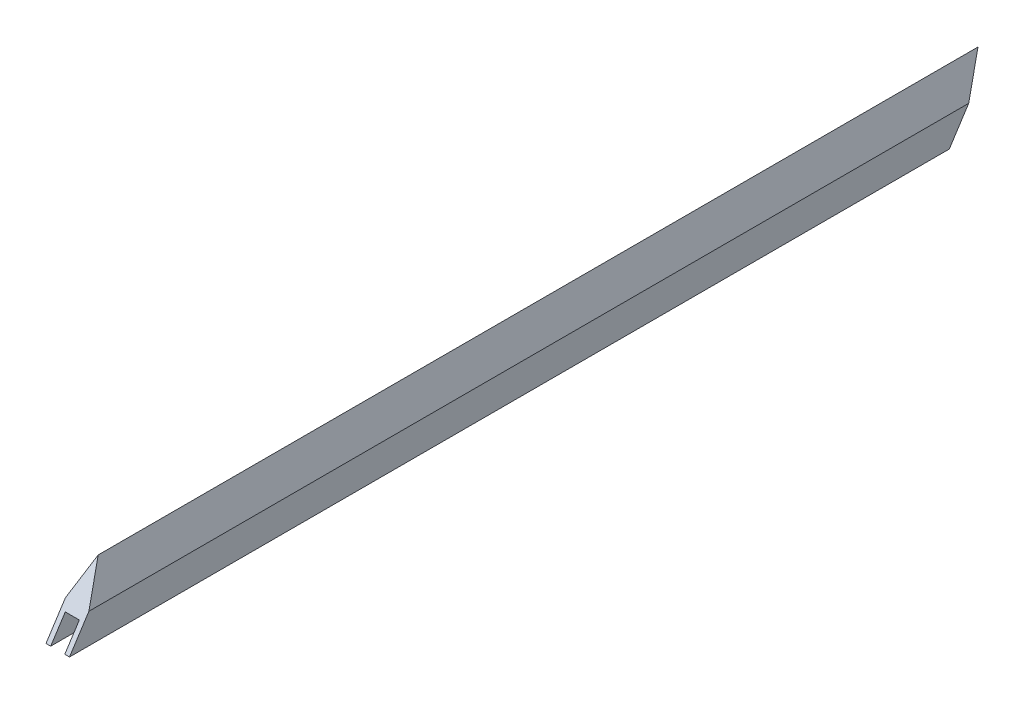
ISO-10303-21;
HEADER;
FILE_DESCRIPTION(('STEP AP214'),'2;1');
FILE_NAME('part.step','',(''),(''),'','','');
FILE_SCHEMA(('AUTOMOTIVE_DESIGN { 1 0 10303 214 1 1 1 1 }'));
ENDSEC;
DATA;
#1=APPLICATION_CONTEXT('core data for automotive mechanical design processes');
#2=APPLICATION_PROTOCOL_DEFINITION('international standard','automotive_design',2000,#1);
#3=PRODUCT_CONTEXT('',#1,'mechanical');
#4=PRODUCT('Part','Part','',(#3));
#5=PRODUCT_RELATED_PRODUCT_CATEGORY('part','',(#4));
#6=PRODUCT_DEFINITION_FORMATION('','',#4);
#7=PRODUCT_DEFINITION_CONTEXT('part definition',#1,'design');
#8=PRODUCT_DEFINITION('design','',#6,#7);
#9=PRODUCT_DEFINITION_SHAPE('','',#8);
#10=(LENGTH_UNIT() NAMED_UNIT(*) SI_UNIT(.MILLI.,.METRE.));
#11=(NAMED_UNIT(*) PLANE_ANGLE_UNIT() SI_UNIT($,.RADIAN.));
#12=(NAMED_UNIT(*) SI_UNIT($,.STERADIAN.) SOLID_ANGLE_UNIT());
#13=UNCERTAINTY_MEASURE_WITH_UNIT(LENGTH_MEASURE(1.E-05),#10,'distance_accuracy_value','');
#14=(GEOMETRIC_REPRESENTATION_CONTEXT(3) GLOBAL_UNCERTAINTY_ASSIGNED_CONTEXT((#13)) GLOBAL_UNIT_ASSIGNED_CONTEXT((#10,
#11,#12)) REPRESENTATION_CONTEXT('',''));
#15=CARTESIAN_POINT('',(0.,0.,0.));
#16=DIRECTION('',(0.,0.,1.));
#17=DIRECTION('',(1.,0.,0.));
#18=AXIS2_PLACEMENT_3D('',#15,#16,#17);
#19=CARTESIAN_POINT('',(0.,5.78299320744687,8.91524470213498));
#20=DIRECTION('',(0.,-0.544199833494635,-0.838955625301131));
#21=DIRECTION('',(0.,0.838955625301131,-0.544199833494635));
#22=AXIS2_PLACEMENT_3D('',#19,#20,#21);
#23=PLANE('',#22);
#24=DIRECTION('',(0.,0.838955625301131,-0.544199833494635));
#25=VECTOR('',#24,1.);
#26=CARTESIAN_POINT('',(2.38760000000002,-134.881067391288,100.158876722642));
#27=LINE('',#26,#25);
#28=CARTESIAN_POINT('',(2.3876,-3.81,15.13786857969));
#29=VERTEX_POINT('',#28);
#30=CARTESIAN_POINT('',(2.3876,3.81,10.1950532433713));
#31=VERTEX_POINT('',#30);
#32=EDGE_CURVE('E136',#29,#31,#27,.T.);
#33=ORIENTED_EDGE('',*,*,#32,.T.);
#34=DIRECTION('',(-1.,0.,0.));
#35=VECTOR('',#34,1.);
#36=CARTESIAN_POINT('',(-2.3876,3.81,10.1950532433713));
#37=LINE('',#36,#35);
#38=CARTESIAN_POINT('',(-2.3876,3.81,10.1950532433714));
#39=VERTEX_POINT('',#38);
#40=EDGE_CURVE('E129',#31,#39,#37,.T.);
#41=ORIENTED_EDGE('',*,*,#40,.T.);
#42=DIRECTION('',(0.,-0.838955625301131,0.544199833494635));
#43=VECTOR('',#42,1.);
#44=CARTESIAN_POINT('',(-2.38759999999998,-134.881067391288,100.158876722642));
#45=LINE('',#44,#43);
#46=CARTESIAN_POINT('',(-2.3876,-3.81,15.13786857969));
#47=VERTEX_POINT('',#46);
#48=EDGE_CURVE('E113',#39,#47,#45,.T.);
#49=ORIENTED_EDGE('',*,*,#48,.T.);
#50=DIRECTION('',(-1.,0.,0.));
#51=VECTOR('',#50,1.);
#52=CARTESIAN_POINT('',(-2.38759999999995,-3.81,15.1378685796899));
#53=LINE('',#52,#51);
#54=CARTESIAN_POINT('',(-3.9878,-3.81,15.13786857969));
#55=VERTEX_POINT('',#54);
#56=EDGE_CURVE('E127',#47,#55,#53,.T.);
#57=ORIENTED_EDGE('',*,*,#56,.T.);
#58=DIRECTION('',(0.,0.838955625301131,-0.544199833494635));
#59=VECTOR('',#58,1.);
#60=CARTESIAN_POINT('',(-3.98780000000001,-140.244378035418,103.637860201021));
#61=LINE('',#60,#59);
#62=CARTESIAN_POINT('',(-3.9878,6.34999999999998,8.54744813126525));
#63=VERTEX_POINT('',#62);
#64=EDGE_CURVE('E130',#55,#63,#61,.T.);
#65=ORIENTED_EDGE('',*,*,#64,.T.);
#66=DIRECTION('',(0.29071969836618,0.802719676698974,-0.520694898786394));
#67=VECTOR('',#66,1.);
#68=CARTESIAN_POINT('',(-50.221433991818,-121.307836531549,91.3544182374829));
#69=LINE('',#68,#67);
#70=CARTESIAN_POINT('',(0.,17.3609,1.40507997028495));
#71=VERTEX_POINT('',#70);
#72=EDGE_CURVE('E171',#63,#71,#69,.T.);
#73=ORIENTED_EDGE('',*,*,#72,.T.);
#74=DIRECTION('',(0.29071969836618,-0.802719676698973,0.520694898786394));
#75=VECTOR('',#74,1.);
#76=CARTESIAN_POINT('',(50.2214339918181,-121.307836531549,91.3544182374829));
#77=LINE('',#76,#75);
#78=CARTESIAN_POINT('',(3.9878,6.35,8.54744813126516));
#79=VERTEX_POINT('',#78);
#80=EDGE_CURVE('E168',#71,#79,#77,.T.);
#81=ORIENTED_EDGE('',*,*,#80,.T.);
#82=DIRECTION('',(0.,-0.838955625301131,0.544199833494635));
#83=VECTOR('',#82,1.);
#84=CARTESIAN_POINT('',(3.9878,-140.244378035418,103.637860201021));
#85=LINE('',#84,#83);
#86=CARTESIAN_POINT('',(3.9878,-3.81,15.13786857969));
#87=VERTEX_POINT('',#86);
#88=EDGE_CURVE('E143',#79,#87,#85,.T.);
#89=ORIENTED_EDGE('',*,*,#88,.T.);
#90=DIRECTION('',(-1.,0.,0.));
#91=VECTOR('',#90,1.);
#92=CARTESIAN_POINT('',(2.3876,-3.81,15.1378685796899));
#93=LINE('',#92,#91);
#94=EDGE_CURVE('E133',#87,#29,#93,.T.);
#95=ORIENTED_EDGE('',*,*,#94,.T.);
#96=EDGE_LOOP('',(#33,#41,#49,#57,#65,#73,#81,#89,#95));
#97=FACE_BOUND('',#96,.T.);
#98=ADVANCED_FACE('F36',(#97),#23,.T.);
#99=CARTESIAN_POINT('',(3.9878,-3.81,313.9694));
#100=DIRECTION('',(-1.,0.,0.));
#101=DIRECTION('',(0.,0.,1.));
#102=AXIS2_PLACEMENT_3D('',#99,#100,#101);
#103=PLANE('',#102);
#104=ORIENTED_EDGE('',*,*,#88,.F.);
#105=DIRECTION('',(0.,0.,-1.));
#106=VECTOR('',#105,1.);
#107=CARTESIAN_POINT('',(3.9878,6.35,313.9694));
#108=LINE('',#107,#106);
#109=CARTESIAN_POINT('',(3.9878,6.35,307.378979551575));
#110=VERTEX_POINT('',#109);
#111=EDGE_CURVE('E150',#110,#79,#108,.T.);
#112=ORIENTED_EDGE('',*,*,#111,.F.);
#113=DIRECTION('',(0.,0.838955625301131,-0.544199833494635));
#114=VECTOR('',#113,1.);
#115=CARTESIAN_POINT('',(3.9878,-3.81000000000002,313.9694));
#116=LINE('',#115,#114);
#117=CARTESIAN_POINT('',(3.9878,-3.81,313.9694));
#118=VERTEX_POINT('',#117);
#119=EDGE_CURVE('E155',#118,#110,#116,.T.);
#120=ORIENTED_EDGE('',*,*,#119,.F.);
#121=DIRECTION('',(0.,0.,-1.));
#122=VECTOR('',#121,1.);
#123=CARTESIAN_POINT('',(3.9878,-3.81,313.9694));
#124=LINE('',#123,#122);
#125=EDGE_CURVE('E40',#118,#87,#124,.T.);
#126=ORIENTED_EDGE('',*,*,#125,.T.);
#127=EDGE_LOOP('',(#104,#112,#120,#126));
#128=FACE_BOUND('',#127,.T.);
#129=ADVANCED_FACE('F200',(#128),#103,.F.);
#130=CARTESIAN_POINT('',(3.9878,6.35,313.9694));
#131=DIRECTION('',(-0.940235920067978,-0.34052373575703,0.));
#132=DIRECTION('',(0.34052373575703,-0.940235920067978,0.));
#133=AXIS2_PLACEMENT_3D('',#130,#131,#132);
#134=PLANE('',#133);
#135=ORIENTED_EDGE('',*,*,#80,.F.);
#136=DIRECTION('',(0.,0.,-1.));
#137=VECTOR('',#136,1.);
#138=CARTESIAN_POINT('',(0.,17.3609,313.9694));
#139=LINE('',#138,#137);
#140=CARTESIAN_POINT('',(0.,17.3609,300.236611390595));
#141=VERTEX_POINT('',#140);
#142=EDGE_CURVE('E149',#141,#71,#139,.T.);
#143=ORIENTED_EDGE('',*,*,#142,.F.);
#144=DIRECTION('',(-0.29071969836618,0.802719676698973,-0.520694898786394));
#145=VECTOR('',#144,1.);
#146=CARTESIAN_POINT('',(4.98543322511807,3.59538851535871,309.165795285418));
#147=LINE('',#146,#145);
#148=EDGE_CURVE('E159',#110,#141,#147,.T.);
#149=ORIENTED_EDGE('',*,*,#148,.F.);
#150=ORIENTED_EDGE('',*,*,#111,.T.);
#151=EDGE_LOOP('',(#135,#143,#149,#150));
#152=FACE_BOUND('',#151,.T.);
#153=ADVANCED_FACE('F198',(#152),#134,.F.);
#154=CARTESIAN_POINT('',(-3.9878,6.35,313.9694));
#155=DIRECTION('',(0.940235920067978,-0.34052373575703,0.));
#156=DIRECTION('',(0.34052373575703,0.940235920067978,0.));
#157=AXIS2_PLACEMENT_3D('',#154,#155,#156);
#158=PLANE('',#157);
#159=ORIENTED_EDGE('',*,*,#72,.F.);
#160=DIRECTION('',(0.,0.,-1.));
#161=VECTOR('',#160,1.);
#162=CARTESIAN_POINT('',(-3.9878,6.35,313.9694));
#163=LINE('',#162,#161);
#164=CARTESIAN_POINT('',(-3.9878,6.35,307.378979551575));
#165=VERTEX_POINT('',#164);
#166=EDGE_CURVE('E147',#165,#63,#163,.T.);
#167=ORIENTED_EDGE('',*,*,#166,.F.);
#168=DIRECTION('',(-0.29071969836618,-0.802719676698973,0.520694898786394));
#169=VECTOR('',#168,1.);
#170=CARTESIAN_POINT('',(-4.98543322511807,3.59538851535871,309.165795285418));
#171=LINE('',#170,#169);
#172=EDGE_CURVE('E163',#141,#165,#171,.T.);
#173=ORIENTED_EDGE('',*,*,#172,.F.);
#174=ORIENTED_EDGE('',*,*,#142,.T.);
#175=EDGE_LOOP('',(#159,#167,#173,#174));
#176=FACE_BOUND('',#175,.T.);
#177=ADVANCED_FACE('F197',(#176),#158,.F.);
#178=CARTESIAN_POINT('',(-3.9878,-3.81,313.9694));
#179=DIRECTION('',(1.,0.,0.));
#180=DIRECTION('',(0.,1.,0.));
#181=AXIS2_PLACEMENT_3D('',#178,#179,#180);
#182=PLANE('',#181);
#183=ORIENTED_EDGE('',*,*,#64,.F.);
#184=DIRECTION('',(0.,0.,-1.));
#185=VECTOR('',#184,1.);
#186=CARTESIAN_POINT('',(-3.9878,-3.81,313.9694));
#187=LINE('',#186,#185);
#188=CARTESIAN_POINT('',(-3.9878,-3.81,313.9694));
#189=VERTEX_POINT('',#188);
#190=EDGE_CURVE('E60',#189,#55,#187,.T.);
#191=ORIENTED_EDGE('',*,*,#190,.F.);
#192=DIRECTION('',(0.,-0.838955625301131,0.544199833494635));
#193=VECTOR('',#192,1.);
#194=CARTESIAN_POINT('',(-3.9878,-3.81000000000001,313.9694));
#195=LINE('',#194,#193);
#196=EDGE_CURVE('E187',#165,#189,#195,.T.);
#197=ORIENTED_EDGE('',*,*,#196,.F.);
#198=ORIENTED_EDGE('',*,*,#166,.T.);
#199=EDGE_LOOP('',(#183,#191,#197,#198));
#200=FACE_BOUND('',#199,.T.);
#201=ADVANCED_FACE('F195',(#200),#182,.F.);
#202=CARTESIAN_POINT('',(-2.3876,3.81,313.9694));
#203=DIRECTION('',(-1.,0.,0.));
#204=DIRECTION('',(0.,-1.,0.));
#205=AXIS2_PLACEMENT_3D('',#202,#203,#204);
#206=PLANE('',#205);
#207=ORIENTED_EDGE('',*,*,#48,.F.);
#208=DIRECTION('',(0.,0.,-1.));
#209=VECTOR('',#208,1.);
#210=CARTESIAN_POINT('',(-2.3876,3.81,313.9694));
#211=LINE('',#210,#209);
#212=CARTESIAN_POINT('',(-2.3876,3.81,309.026584663681));
#213=VERTEX_POINT('',#212);
#214=EDGE_CURVE('E121',#213,#39,#211,.T.);
#215=ORIENTED_EDGE('',*,*,#214,.F.);
#216=DIRECTION('',(0.,0.838955625301131,-0.544199833494635));
#217=VECTOR('',#216,1.);
#218=CARTESIAN_POINT('',(-2.3876,1.55331064413,310.490416521621));
#219=LINE('',#218,#217);
#220=CARTESIAN_POINT('',(-2.3876,-3.81,313.9694));
#221=VERTEX_POINT('',#220);
#222=EDGE_CURVE('E116',#221,#213,#219,.T.);
#223=ORIENTED_EDGE('',*,*,#222,.F.);
#224=DIRECTION('',(0.,0.,-1.));
#225=VECTOR('',#224,1.);
#226=CARTESIAN_POINT('',(-2.3876,-3.81,313.9694));
#227=LINE('',#226,#225);
#228=EDGE_CURVE('E110',#221,#47,#227,.T.);
#229=ORIENTED_EDGE('',*,*,#228,.T.);
#230=EDGE_LOOP('',(#207,#215,#223,#229));
#231=FACE_BOUND('',#230,.T.);
#232=ADVANCED_FACE('F112',(#231),#206,.F.);
#233=CARTESIAN_POINT('',(-2.3876,3.81,313.9694));
#234=DIRECTION('',(0.,1.,0.));
#235=DIRECTION('',(0.,0.,1.));
#236=AXIS2_PLACEMENT_3D('',#233,#234,#235);
#237=PLANE('',#236);
#238=ORIENTED_EDGE('',*,*,#40,.F.);
#239=DIRECTION('',(0.,0.,-1.));
#240=VECTOR('',#239,1.);
#241=CARTESIAN_POINT('',(2.3876,3.81,313.9694));
#242=LINE('',#241,#240);
#243=CARTESIAN_POINT('',(2.3876,3.81,309.026584663681));
#244=VERTEX_POINT('',#243);
#245=EDGE_CURVE('E142',#244,#31,#242,.T.);
#246=ORIENTED_EDGE('',*,*,#245,.F.);
#247=DIRECTION('',(1.,0.,0.));
#248=VECTOR('',#247,1.);
#249=CARTESIAN_POINT('',(-2.3876,3.81,309.026584663681));
#250=LINE('',#249,#248);
#251=EDGE_CURVE('E185',#213,#244,#250,.T.);
#252=ORIENTED_EDGE('',*,*,#251,.F.);
#253=ORIENTED_EDGE('',*,*,#214,.T.);
#254=EDGE_LOOP('',(#238,#246,#252,#253));
#255=FACE_BOUND('',#254,.T.);
#256=ADVANCED_FACE('F184',(#255),#237,.F.);
#257=CARTESIAN_POINT('',(2.3876,3.81,313.9694));
#258=DIRECTION('',(1.,0.,0.));
#259=DIRECTION('',(0.,1.,0.));
#260=AXIS2_PLACEMENT_3D('',#257,#258,#259);
#261=PLANE('',#260);
#262=ORIENTED_EDGE('',*,*,#32,.F.);
#263=DIRECTION('',(0.,0.,-1.));
#264=VECTOR('',#263,1.);
#265=CARTESIAN_POINT('',(2.3876,-3.81,313.9694));
#266=LINE('',#265,#264);
#267=CARTESIAN_POINT('',(2.3876,-3.81,313.9694));
#268=VERTEX_POINT('',#267);
#269=EDGE_CURVE('E140',#268,#29,#266,.T.);
#270=ORIENTED_EDGE('',*,*,#269,.F.);
#271=DIRECTION('',(0.,-0.838955625301131,0.544199833494635));
#272=VECTOR('',#271,1.);
#273=CARTESIAN_POINT('',(2.3876,1.55331064413,310.490416521621));
#274=LINE('',#273,#272);
#275=EDGE_CURVE('E180',#244,#268,#274,.T.);
#276=ORIENTED_EDGE('',*,*,#275,.F.);
#277=ORIENTED_EDGE('',*,*,#245,.T.);
#278=EDGE_LOOP('',(#262,#270,#276,#277));
#279=FACE_BOUND('',#278,.T.);
#280=ADVANCED_FACE('F177',(#279),#261,.F.);
#281=CARTESIAN_POINT('',(2.3876,-3.81,313.9694));
#282=DIRECTION('',(0.,1.,0.));
#283=DIRECTION('',(0.,0.,1.));
#284=AXIS2_PLACEMENT_3D('',#281,#282,#283);
#285=PLANE('',#284);
#286=ORIENTED_EDGE('',*,*,#94,.F.);
#287=ORIENTED_EDGE('',*,*,#125,.F.);
#288=DIRECTION('',(1.,0.,0.));
#289=VECTOR('',#288,1.);
#290=CARTESIAN_POINT('',(2.3876,-3.81,313.9694));
#291=LINE('',#290,#289);
#292=EDGE_CURVE('E11',#268,#118,#291,.T.);
#293=ORIENTED_EDGE('',*,*,#292,.F.);
#294=ORIENTED_EDGE('',*,*,#269,.T.);
#295=EDGE_LOOP('',(#286,#287,#293,#294));
#296=FACE_BOUND('',#295,.T.);
#297=ADVANCED_FACE('F38',(#296),#285,.F.);
#298=CARTESIAN_POINT('',(-2.3876,-3.81,313.9694));
#299=DIRECTION('',(0.,1.,0.));
#300=DIRECTION('',(-1.,0.,0.));
#301=AXIS2_PLACEMENT_3D('',#298,#299,#300);
#302=PLANE('',#301);
#303=ORIENTED_EDGE('',*,*,#56,.F.);
#304=ORIENTED_EDGE('',*,*,#228,.F.);
#305=DIRECTION('',(1.,0.,0.));
#306=VECTOR('',#305,1.);
#307=CARTESIAN_POINT('',(-2.3876,-3.81,313.9694));
#308=LINE('',#307,#306);
#309=EDGE_CURVE('E45',#189,#221,#308,.T.);
#310=ORIENTED_EDGE('',*,*,#309,.F.);
#311=ORIENTED_EDGE('',*,*,#190,.T.);
#312=EDGE_LOOP('',(#303,#304,#310,#311));
#313=FACE_BOUND('',#312,.T.);
#314=ADVANCED_FACE('F132',(#313),#302,.F.);
#315=CARTESIAN_POINT('',(0.,142.217371242865,219.246784501114));
#316=DIRECTION('',(0.,0.544199833494635,0.838955625301131));
#317=DIRECTION('',(0.,-0.838955625301131,0.544199833494635));
#318=AXIS2_PLACEMENT_3D('',#315,#316,#317);
#319=PLANE('',#318);
#320=ORIENTED_EDGE('',*,*,#292,.T.);
#321=ORIENTED_EDGE('',*,*,#119,.T.);
#322=ORIENTED_EDGE('',*,*,#148,.T.);
#323=ORIENTED_EDGE('',*,*,#172,.T.);
#324=ORIENTED_EDGE('',*,*,#196,.T.);
#325=ORIENTED_EDGE('',*,*,#309,.T.);
#326=ORIENTED_EDGE('',*,*,#222,.T.);
#327=ORIENTED_EDGE('',*,*,#251,.T.);
#328=ORIENTED_EDGE('',*,*,#275,.T.);
#329=EDGE_LOOP('',(#320,#321,#322,#323,#324,#325,#326,#327,#328));
#330=FACE_BOUND('',#329,.T.);
#331=ADVANCED_FACE('F186',(#330),#319,.T.);
#332=CLOSED_SHELL('',(#98,#129,#153,#177,#201,#232,#256,#280,#297,#314,#331));
#333=MANIFOLD_SOLID_BREP('B2',#332);
#334=ADVANCED_BREP_SHAPE_REPRESENTATION('',(#18,#333),#14);
#335=SHAPE_DEFINITION_REPRESENTATION(#9,#334);
ENDSEC;
END-ISO-10303-21;
